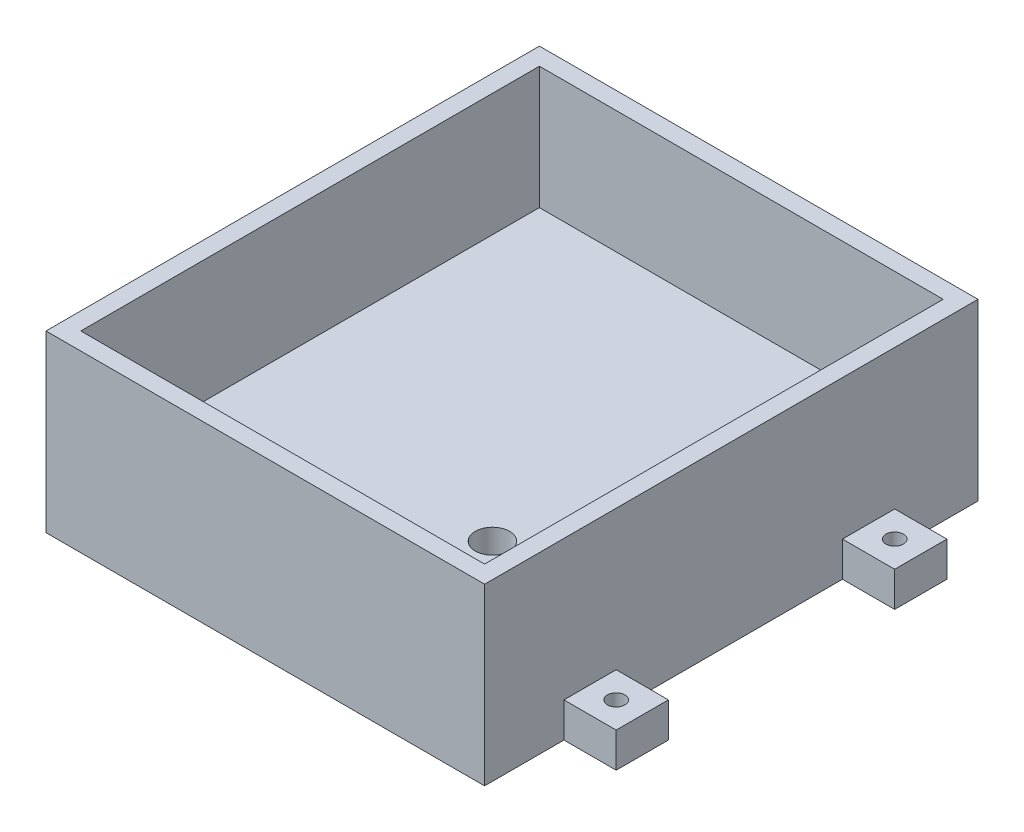
ISO-10303-21;
HEADER;
FILE_DESCRIPTION(('STEP AP214'),'2;1');
FILE_NAME('part.step','',(''),(''),'','','');
FILE_SCHEMA(('AUTOMOTIVE_DESIGN { 1 0 10303 214 1 1 1 1 }'));
ENDSEC;
DATA;
#1=APPLICATION_CONTEXT('core data for automotive mechanical design processes');
#2=APPLICATION_PROTOCOL_DEFINITION('international standard','automotive_design',2000,#1);
#3=PRODUCT_CONTEXT('',#1,'mechanical');
#4=PRODUCT('Part','Part','',(#3));
#5=PRODUCT_RELATED_PRODUCT_CATEGORY('part','',(#4));
#6=PRODUCT_DEFINITION_FORMATION('','',#4);
#7=PRODUCT_DEFINITION_CONTEXT('part definition',#1,'design');
#8=PRODUCT_DEFINITION('design','',#6,#7);
#9=PRODUCT_DEFINITION_SHAPE('','',#8);
#10=(LENGTH_UNIT() NAMED_UNIT(*) SI_UNIT(.MILLI.,.METRE.));
#11=(NAMED_UNIT(*) PLANE_ANGLE_UNIT() SI_UNIT($,.RADIAN.));
#12=(NAMED_UNIT(*) SI_UNIT($,.STERADIAN.) SOLID_ANGLE_UNIT());
#13=UNCERTAINTY_MEASURE_WITH_UNIT(LENGTH_MEASURE(1.E-05),#10,'distance_accuracy_value','');
#14=(GEOMETRIC_REPRESENTATION_CONTEXT(3) GLOBAL_UNCERTAINTY_ASSIGNED_CONTEXT((#13)) GLOBAL_UNIT_ASSIGNED_CONTEXT((#10,
#11,#12)) REPRESENTATION_CONTEXT('',''));
#15=CARTESIAN_POINT('',(0.,0.,0.));
#16=DIRECTION('',(0.,0.,1.));
#17=DIRECTION('',(1.,0.,0.));
#18=AXIS2_PLACEMENT_3D('',#15,#16,#17);
#19=CARTESIAN_POINT('',(80.,19.05,90.));
#20=DIRECTION('',(-1.,0.,0.));
#21=DIRECTION('',(0.,0.,1.));
#22=AXIS2_PLACEMENT_3D('',#19,#20,#21);
#23=PLANE('',#22);
#24=DIRECTION('',(0.,0.,-1.));
#25=VECTOR('',#24,1.);
#26=CARTESIAN_POINT('',(80.,12.7,41.995));
#27=LINE('',#26,#25);
#28=CARTESIAN_POINT('',(80.,12.7,61.045));
#29=VERTEX_POINT('',#28);
#30=CARTESIAN_POINT('',(80.,12.7,41.995));
#31=VERTEX_POINT('',#30);
#32=EDGE_CURVE('E51',#29,#31,#27,.T.);
#33=ORIENTED_EDGE('',*,*,#32,.T.);
#34=DIRECTION('',(0.,-1.,0.));
#35=VECTOR('',#34,1.);
#36=CARTESIAN_POINT('',(80.,12.7,41.995));
#37=LINE('',#36,#35);
#38=CARTESIAN_POINT('',(80.,0.,41.995));
#39=VERTEX_POINT('',#38);
#40=EDGE_CURVE('E229',#31,#39,#37,.T.);
#41=ORIENTED_EDGE('',*,*,#40,.T.);
#42=DIRECTION('',(0.,0.,-1.));
#43=VECTOR('',#42,1.);
#44=CARTESIAN_POINT('',(80.,0.,90.));
#45=LINE('',#44,#43);
#46=CARTESIAN_POINT('',(80.,0.,-40.555));
#47=VERTEX_POINT('',#46);
#48=EDGE_CURVE('E410',#39,#47,#45,.T.);
#49=ORIENTED_EDGE('',*,*,#48,.T.);
#50=DIRECTION('',(0.,-1.,0.));
#51=VECTOR('',#50,1.);
#52=CARTESIAN_POINT('',(80.,12.7,-40.555));
#53=LINE('',#52,#51);
#54=CARTESIAN_POINT('',(80.,12.7,-40.555));
#55=VERTEX_POINT('',#54);
#56=EDGE_CURVE('E265',#55,#47,#53,.T.);
#57=ORIENTED_EDGE('',*,*,#56,.F.);
#58=DIRECTION('',(0.,0.,-1.));
#59=VECTOR('',#58,1.);
#60=CARTESIAN_POINT('',(80.,12.7,-59.605));
#61=LINE('',#60,#59);
#62=CARTESIAN_POINT('',(80.,12.7,-59.605));
#63=VERTEX_POINT('',#62);
#64=EDGE_CURVE('E245',#55,#63,#61,.T.);
#65=ORIENTED_EDGE('',*,*,#64,.T.);
#66=DIRECTION('',(0.,-1.,0.));
#67=VECTOR('',#66,1.);
#68=CARTESIAN_POINT('',(80.,12.7,-59.605));
#69=LINE('',#68,#67);
#70=CARTESIAN_POINT('',(80.,0.,-59.6049999999999));
#71=VERTEX_POINT('',#70);
#72=EDGE_CURVE('E262',#63,#71,#69,.T.);
#73=ORIENTED_EDGE('',*,*,#72,.T.);
#74=CARTESIAN_POINT('',(80.,0.,-90.));
#75=VERTEX_POINT('',#74);
#76=EDGE_CURVE('E406',#71,#75,#45,.T.);
#77=ORIENTED_EDGE('',*,*,#76,.T.);
#78=DIRECTION('',(0.,-1.,0.));
#79=VECTOR('',#78,1.);
#80=CARTESIAN_POINT('',(80.,19.05,-90.));
#81=LINE('',#80,#79);
#82=CARTESIAN_POINT('',(80.,63.730000048,-90.));
#83=VERTEX_POINT('',#82);
#84=EDGE_CURVE('E11',#83,#75,#81,.T.);
#85=ORIENTED_EDGE('',*,*,#84,.F.);
#86=DIRECTION('',(0.,0.,-1.));
#87=VECTOR('',#86,1.);
#88=CARTESIAN_POINT('',(80.,63.730000048,-90.));
#89=LINE('',#88,#87);
#90=CARTESIAN_POINT('',(80.,63.730000048,90.));
#91=VERTEX_POINT('',#90);
#92=EDGE_CURVE('E400',#91,#83,#89,.T.);
#93=ORIENTED_EDGE('',*,*,#92,.F.);
#94=DIRECTION('',(0.,-1.,0.));
#95=VECTOR('',#94,1.);
#96=CARTESIAN_POINT('',(80.,19.05,90.));
#97=LINE('',#96,#95);
#98=CARTESIAN_POINT('',(80.,0.,90.));
#99=VERTEX_POINT('',#98);
#100=EDGE_CURVE('E419',#91,#99,#97,.T.);
#101=ORIENTED_EDGE('',*,*,#100,.T.);
#102=CARTESIAN_POINT('',(80.,0.,61.045));
#103=VERTEX_POINT('',#102);
#104=EDGE_CURVE('E407',#99,#103,#45,.T.);
#105=ORIENTED_EDGE('',*,*,#104,.T.);
#106=DIRECTION('',(0.,-1.,0.));
#107=VECTOR('',#106,1.);
#108=CARTESIAN_POINT('',(80.,12.7,61.045));
#109=LINE('',#108,#107);
#110=EDGE_CURVE('E47',#29,#103,#109,.T.);
#111=ORIENTED_EDGE('',*,*,#110,.F.);
#112=EDGE_LOOP('',(#33,#41,#49,#57,#65,#73,#77,#85,#93,#101,#105,#111));
#113=FACE_BOUND('',#112,.T.);
#114=ADVANCED_FACE('F33',(#113),#23,.F.);
#115=CARTESIAN_POINT('',(-80.,19.05,90.));
#116=DIRECTION('',(1.,0.,0.));
#117=DIRECTION('',(0.,0.,-1.));
#118=AXIS2_PLACEMENT_3D('',#115,#116,#117);
#119=PLANE('',#118);
#120=DIRECTION('',(0.,0.,1.));
#121=VECTOR('',#120,1.);
#122=CARTESIAN_POINT('',(-80.,0.,90.));
#123=LINE('',#122,#121);
#124=CARTESIAN_POINT('',(-80.,0.,-40.5549999999999));
#125=VERTEX_POINT('',#124);
#126=CARTESIAN_POINT('',(-80.,0.,41.995));
#127=VERTEX_POINT('',#126);
#128=EDGE_CURVE('E417',#125,#127,#123,.T.);
#129=ORIENTED_EDGE('',*,*,#128,.T.);
#130=DIRECTION('',(0.,-1.,0.));
#131=VECTOR('',#130,1.);
#132=CARTESIAN_POINT('',(-80.,12.7,41.995));
#133=LINE('',#132,#131);
#134=CARTESIAN_POINT('',(-80.,12.7,41.995));
#135=VERTEX_POINT('',#134);
#136=EDGE_CURVE('E295',#135,#127,#133,.T.);
#137=ORIENTED_EDGE('',*,*,#136,.F.);
#138=DIRECTION('',(0.,0.,1.));
#139=VECTOR('',#138,1.);
#140=CARTESIAN_POINT('',(-80.,12.7,41.995));
#141=LINE('',#140,#139);
#142=CARTESIAN_POINT('',(-80.,12.7,61.045));
#143=VERTEX_POINT('',#142);
#144=EDGE_CURVE('E275',#135,#143,#141,.T.);
#145=ORIENTED_EDGE('',*,*,#144,.T.);
#146=DIRECTION('',(0.,-1.,0.));
#147=VECTOR('',#146,1.);
#148=CARTESIAN_POINT('',(-80.,12.7,61.045));
#149=LINE('',#148,#147);
#150=CARTESIAN_POINT('',(-80.,0.,61.045));
#151=VERTEX_POINT('',#150);
#152=EDGE_CURVE('E287',#143,#151,#149,.T.);
#153=ORIENTED_EDGE('',*,*,#152,.T.);
#154=CARTESIAN_POINT('',(-80.,0.,90.));
#155=VERTEX_POINT('',#154);
#156=EDGE_CURVE('E412',#151,#155,#123,.T.);
#157=ORIENTED_EDGE('',*,*,#156,.T.);
#158=DIRECTION('',(0.,-1.,0.));
#159=VECTOR('',#158,1.);
#160=CARTESIAN_POINT('',(-80.,19.05,90.));
#161=LINE('',#160,#159);
#162=CARTESIAN_POINT('',(-80.,63.730000048,90.));
#163=VERTEX_POINT('',#162);
#164=EDGE_CURVE('E422',#163,#155,#161,.T.);
#165=ORIENTED_EDGE('',*,*,#164,.F.);
#166=DIRECTION('',(0.,0.,1.));
#167=VECTOR('',#166,1.);
#168=CARTESIAN_POINT('',(-80.,63.730000048,-90.));
#169=LINE('',#168,#167);
#170=CARTESIAN_POINT('',(-80.,63.730000048,-90.));
#171=VERTEX_POINT('',#170);
#172=EDGE_CURVE('E394',#171,#163,#169,.T.);
#173=ORIENTED_EDGE('',*,*,#172,.F.);
#174=DIRECTION('',(0.,-1.,0.));
#175=VECTOR('',#174,1.);
#176=CARTESIAN_POINT('',(-80.,19.05,-90.));
#177=LINE('',#176,#175);
#178=CARTESIAN_POINT('',(-80.,0.,-90.));
#179=VERTEX_POINT('',#178);
#180=EDGE_CURVE('E40',#171,#179,#177,.T.);
#181=ORIENTED_EDGE('',*,*,#180,.T.);
#182=CARTESIAN_POINT('',(-80.,0.,-59.605));
#183=VERTEX_POINT('',#182);
#184=EDGE_CURVE('E413',#179,#183,#123,.T.);
#185=ORIENTED_EDGE('',*,*,#184,.T.);
#186=DIRECTION('',(0.,-1.,0.));
#187=VECTOR('',#186,1.);
#188=CARTESIAN_POINT('',(-80.,12.7,-59.605));
#189=LINE('',#188,#187);
#190=CARTESIAN_POINT('',(-80.,12.7,-59.605));
#191=VERTEX_POINT('',#190);
#192=EDGE_CURVE('E332',#191,#183,#189,.T.);
#193=ORIENTED_EDGE('',*,*,#192,.F.);
#194=DIRECTION('',(0.,0.,1.));
#195=VECTOR('',#194,1.);
#196=CARTESIAN_POINT('',(-80.,12.7,-59.605));
#197=LINE('',#196,#195);
#198=CARTESIAN_POINT('',(-80.,12.7,-40.555));
#199=VERTEX_POINT('',#198);
#200=EDGE_CURVE('E311',#191,#199,#197,.T.);
#201=ORIENTED_EDGE('',*,*,#200,.T.);
#202=DIRECTION('',(0.,-1.,0.));
#203=VECTOR('',#202,1.);
#204=CARTESIAN_POINT('',(-80.,12.7,-40.555));
#205=LINE('',#204,#203);
#206=EDGE_CURVE('E324',#199,#125,#205,.T.);
#207=ORIENTED_EDGE('',*,*,#206,.T.);
#208=EDGE_LOOP('',(#129,#137,#145,#153,#157,#165,#173,#181,#185,#193,#201,#207));
#209=FACE_BOUND('',#208,.T.);
#210=ADVANCED_FACE('F428',(#209),#119,.F.);
#211=CARTESIAN_POINT('',(-80.,19.05,-90.));
#212=DIRECTION('',(0.,0.,1.));
#213=DIRECTION('',(1.,0.,0.));
#214=AXIS2_PLACEMENT_3D('',#211,#212,#213);
#215=PLANE('',#214);
#216=DIRECTION('',(-1.,0.,0.));
#217=VECTOR('',#216,1.);
#218=CARTESIAN_POINT('',(-80.,0.,-90.));
#219=LINE('',#218,#217);
#220=EDGE_CURVE('E409',#75,#179,#219,.T.);
#221=ORIENTED_EDGE('',*,*,#220,.T.);
#222=ORIENTED_EDGE('',*,*,#180,.F.);
#223=DIRECTION('',(-1.,0.,0.));
#224=VECTOR('',#223,1.);
#225=CARTESIAN_POINT('',(-80.,63.730000048,-90.));
#226=LINE('',#225,#224);
#227=EDGE_CURVE('E403',#83,#171,#226,.T.);
#228=ORIENTED_EDGE('',*,*,#227,.F.);
#229=ORIENTED_EDGE('',*,*,#84,.T.);
#230=EDGE_LOOP('',(#221,#222,#228,#229));
#231=FACE_BOUND('',#230,.T.);
#232=ADVANCED_FACE('F461',(#231),#215,.F.);
#233=CARTESIAN_POINT('',(-80.,19.05,90.));
#234=DIRECTION('',(0.,0.,-1.));
#235=DIRECTION('',(-1.,0.,0.));
#236=AXIS2_PLACEMENT_3D('',#233,#234,#235);
#237=PLANE('',#236);
#238=DIRECTION('',(1.,0.,0.));
#239=VECTOR('',#238,1.);
#240=CARTESIAN_POINT('',(-80.,0.,90.));
#241=LINE('',#240,#239);
#242=EDGE_CURVE('E416',#155,#99,#241,.T.);
#243=ORIENTED_EDGE('',*,*,#242,.T.);
#244=ORIENTED_EDGE('',*,*,#100,.F.);
#245=DIRECTION('',(1.,0.,0.));
#246=VECTOR('',#245,1.);
#247=CARTESIAN_POINT('',(-80.,63.730000048,90.));
#248=LINE('',#247,#246);
#249=EDGE_CURVE('E397',#163,#91,#248,.T.);
#250=ORIENTED_EDGE('',*,*,#249,.F.);
#251=ORIENTED_EDGE('',*,*,#164,.T.);
#252=EDGE_LOOP('',(#243,#244,#250,#251));
#253=FACE_BOUND('',#252,.T.);
#254=ADVANCED_FACE('F456',(#253),#237,.F.);
#255=CARTESIAN_POINT('',(0.,0.,0.));
#256=DIRECTION('',(0.,-1.,0.));
#257=DIRECTION('',(0.,0.,-1.));
#258=AXIS2_PLACEMENT_3D('',#255,#256,#257);
#259=PLANE('',#258);
#260=ORIENTED_EDGE('',*,*,#104,.F.);
#261=ORIENTED_EDGE('',*,*,#242,.F.);
#262=ORIENTED_EDGE('',*,*,#156,.F.);
#263=DIRECTION('',(-1.,0.,0.));
#264=VECTOR('',#263,1.);
#265=CARTESIAN_POINT('',(-80.,0.,61.045));
#266=LINE('',#265,#264);
#267=CARTESIAN_POINT('',(-99.05,0.,61.045));
#268=VERTEX_POINT('',#267);
#269=EDGE_CURVE('E272',#151,#268,#266,.T.);
#270=ORIENTED_EDGE('',*,*,#269,.T.);
#271=DIRECTION('',(0.,0.,-1.));
#272=VECTOR('',#271,1.);
#273=CARTESIAN_POINT('',(-99.05,0.,41.995));
#274=LINE('',#273,#272);
#275=CARTESIAN_POINT('',(-99.05,0.,41.995));
#276=VERTEX_POINT('',#275);
#277=EDGE_CURVE('E290',#268,#276,#274,.T.);
#278=ORIENTED_EDGE('',*,*,#277,.T.);
#279=DIRECTION('',(1.,0.,0.));
#280=VECTOR('',#279,1.);
#281=CARTESIAN_POINT('',(-80.,0.,41.995));
#282=LINE('',#281,#280);
#283=EDGE_CURVE('E278',#276,#127,#282,.T.);
#284=ORIENTED_EDGE('',*,*,#283,.T.);
#285=ORIENTED_EDGE('',*,*,#128,.F.);
#286=DIRECTION('',(-1.,0.,0.));
#287=VECTOR('',#286,1.);
#288=CARTESIAN_POINT('',(-80.,0.,-40.555));
#289=LINE('',#288,#287);
#290=CARTESIAN_POINT('',(-99.05,0.,-40.555));
#291=VERTEX_POINT('',#290);
#292=EDGE_CURVE('E308',#125,#291,#289,.T.);
#293=ORIENTED_EDGE('',*,*,#292,.T.);
#294=DIRECTION('',(0.,0.,-1.));
#295=VECTOR('',#294,1.);
#296=CARTESIAN_POINT('',(-99.05,0.,-59.605));
#297=LINE('',#296,#295);
#298=CARTESIAN_POINT('',(-99.05,0.,-59.605));
#299=VERTEX_POINT('',#298);
#300=EDGE_CURVE('E327',#291,#299,#297,.T.);
#301=ORIENTED_EDGE('',*,*,#300,.T.);
#302=DIRECTION('',(1.,0.,0.));
#303=VECTOR('',#302,1.);
#304=CARTESIAN_POINT('',(-80.,0.,-59.605));
#305=LINE('',#304,#303);
#306=EDGE_CURVE('E315',#299,#183,#305,.T.);
#307=ORIENTED_EDGE('',*,*,#306,.T.);
#308=ORIENTED_EDGE('',*,*,#184,.F.);
#309=ORIENTED_EDGE('',*,*,#220,.F.);
#310=ORIENTED_EDGE('',*,*,#76,.F.);
#311=DIRECTION('',(1.,0.,0.));
#312=VECTOR('',#311,1.);
#313=CARTESIAN_POINT('',(99.05,0.,-59.605));
#314=LINE('',#313,#312);
#315=CARTESIAN_POINT('',(99.05,0.,-59.605));
#316=VERTEX_POINT('',#315);
#317=EDGE_CURVE('E242',#71,#316,#314,.T.);
#318=ORIENTED_EDGE('',*,*,#317,.T.);
#319=DIRECTION('',(0.,0.,1.));
#320=VECTOR('',#319,1.);
#321=CARTESIAN_POINT('',(99.05,0.,-59.605));
#322=LINE('',#321,#320);
#323=CARTESIAN_POINT('',(99.05,0.,-40.555));
#324=VERTEX_POINT('',#323);
#325=EDGE_CURVE('E235',#316,#324,#322,.T.);
#326=ORIENTED_EDGE('',*,*,#325,.T.);
#327=DIRECTION('',(-1.,0.,0.));
#328=VECTOR('',#327,1.);
#329=CARTESIAN_POINT('',(99.05,0.,-40.555));
#330=LINE('',#329,#328);
#331=EDGE_CURVE('E254',#324,#47,#330,.T.);
#332=ORIENTED_EDGE('',*,*,#331,.T.);
#333=ORIENTED_EDGE('',*,*,#48,.F.);
#334=DIRECTION('',(1.,0.,0.));
#335=VECTOR('',#334,1.);
#336=CARTESIAN_POINT('',(99.05,0.,41.995));
#337=LINE('',#336,#335);
#338=CARTESIAN_POINT('',(99.05,0.,41.995));
#339=VERTEX_POINT('',#338);
#340=EDGE_CURVE('E213',#39,#339,#337,.T.);
#341=ORIENTED_EDGE('',*,*,#340,.T.);
#342=DIRECTION('',(0.,0.,1.));
#343=VECTOR('',#342,1.);
#344=CARTESIAN_POINT('',(99.05,0.,41.995));
#345=LINE('',#344,#343);
#346=CARTESIAN_POINT('',(99.05,0.,61.045));
#347=VERTEX_POINT('',#346);
#348=EDGE_CURVE('E223',#339,#347,#345,.T.);
#349=ORIENTED_EDGE('',*,*,#348,.T.);
#350=DIRECTION('',(-1.,0.,0.));
#351=VECTOR('',#350,1.);
#352=CARTESIAN_POINT('',(99.05,0.,61.045));
#353=LINE('',#352,#351);
#354=EDGE_CURVE('E197',#347,#103,#353,.T.);
#355=ORIENTED_EDGE('',*,*,#354,.T.);
#356=EDGE_LOOP('',(#260,#261,#262,#270,#278,#284,#285,#293,#301,#307,#308,#309,#310,#318,#326,
#332,#333,#341,#349,#355));
#357=FACE_BOUND('',#356,.T.);
#358=CARTESIAN_POINT('',(-89.525,0.,-50.08));
#359=DIRECTION('',(0.,-1.,0.));
#360=DIRECTION('',(0.,0.,-1.));
#361=AXIS2_PLACEMENT_3D('',#358,#359,#360);
#362=CIRCLE('',#361,3.175);
#363=CARTESIAN_POINT('',(-89.525,0.,-53.255));
#364=VERTEX_POINT('',#363);
#365=EDGE_CURVE('E298',#364,#364,#362,.T.);
#366=ORIENTED_EDGE('',*,*,#365,.F.);
#367=EDGE_LOOP('',(#366));
#368=FACE_BOUND('',#367,.T.);
#369=CARTESIAN_POINT('',(-89.525,0.,51.52));
#370=DIRECTION('',(0.,-1.,0.));
#371=DIRECTION('',(0.,0.,-1.));
#372=AXIS2_PLACEMENT_3D('',#369,#370,#371);
#373=CIRCLE('',#372,3.175);
#374=CARTESIAN_POINT('',(-89.525,0.,48.345));
#375=VERTEX_POINT('',#374);
#376=EDGE_CURVE('E261',#375,#375,#373,.T.);
#377=ORIENTED_EDGE('',*,*,#376,.F.);
#378=EDGE_LOOP('',(#377));
#379=FACE_BOUND('',#378,.T.);
#380=CARTESIAN_POINT('',(89.525,0.,-50.08));
#381=DIRECTION('',(0.,-1.,0.));
#382=DIRECTION('',(0.,0.,-1.));
#383=AXIS2_PLACEMENT_3D('',#380,#381,#382);
#384=CIRCLE('',#383,3.175);
#385=CARTESIAN_POINT('',(89.525,0.,-53.255));
#386=VERTEX_POINT('',#385);
#387=EDGE_CURVE('E228',#386,#386,#384,.T.);
#388=ORIENTED_EDGE('',*,*,#387,.F.);
#389=EDGE_LOOP('',(#388));
#390=FACE_BOUND('',#389,.T.);
#391=CARTESIAN_POINT('',(89.525,0.,51.52));
#392=DIRECTION('',(0.,-1.,0.));
#393=DIRECTION('',(0.,0.,-1.));
#394=AXIS2_PLACEMENT_3D('',#391,#392,#393);
#395=CIRCLE('',#394,3.175);
#396=CARTESIAN_POINT('',(89.525,0.,48.345));
#397=VERTEX_POINT('',#396);
#398=EDGE_CURVE('E218',#397,#397,#395,.T.);
#399=ORIENTED_EDGE('',*,*,#398,.F.);
#400=EDGE_LOOP('',(#399));
#401=FACE_BOUND('',#400,.T.);
#402=ADVANCED_FACE('F435',(#357,#368,#379,#390,#401),#259,.T.);
#403=CARTESIAN_POINT('',(0.,63.730000048,0.));
#404=DIRECTION('',(0.,1.,0.));
#405=DIRECTION('',(0.,0.,1.));
#406=AXIS2_PLACEMENT_3D('',#403,#404,#405);
#407=PLANE('',#406);
#408=ORIENTED_EDGE('',*,*,#172,.T.);
#409=ORIENTED_EDGE('',*,*,#249,.T.);
#410=ORIENTED_EDGE('',*,*,#92,.T.);
#411=ORIENTED_EDGE('',*,*,#227,.T.);
#412=EDGE_LOOP('',(#408,#409,#410,#411));
#413=FACE_BOUND('',#412,.T.);
#414=DIRECTION('',(1.,0.,0.));
#415=VECTOR('',#414,1.);
#416=CARTESIAN_POINT('',(-73.65,63.730000048,83.65));
#417=LINE('',#416,#415);
#418=CARTESIAN_POINT('',(-73.65,63.730000048,83.65));
#419=VERTEX_POINT('',#418);
#420=CARTESIAN_POINT('',(73.65,63.730000048,83.65));
#421=VERTEX_POINT('',#420);
#422=EDGE_CURVE('E367',#419,#421,#417,.T.);
#423=ORIENTED_EDGE('',*,*,#422,.F.);
#424=DIRECTION('',(0.,0.,1.));
#425=VECTOR('',#424,1.);
#426=CARTESIAN_POINT('',(-73.65,63.730000048,-83.65));
#427=LINE('',#426,#425);
#428=CARTESIAN_POINT('',(-73.65,63.730000048,-83.65));
#429=VERTEX_POINT('',#428);
#430=EDGE_CURVE('E365',#429,#419,#427,.T.);
#431=ORIENTED_EDGE('',*,*,#430,.F.);
#432=DIRECTION('',(-1.,0.,0.));
#433=VECTOR('',#432,1.);
#434=CARTESIAN_POINT('',(-73.65,63.730000048,-83.65));
#435=LINE('',#434,#433);
#436=CARTESIAN_POINT('',(73.65,63.730000048,-83.65));
#437=VERTEX_POINT('',#436);
#438=EDGE_CURVE('E373',#437,#429,#435,.T.);
#439=ORIENTED_EDGE('',*,*,#438,.F.);
#440=DIRECTION('',(0.,0.,-1.));
#441=VECTOR('',#440,1.);
#442=CARTESIAN_POINT('',(73.65,63.730000048,-83.65));
#443=LINE('',#442,#441);
#444=EDGE_CURVE('E370',#421,#437,#443,.T.);
#445=ORIENTED_EDGE('',*,*,#444,.F.);
#446=EDGE_LOOP('',(#423,#431,#439,#445));
#447=FACE_BOUND('',#446,.T.);
#448=ADVANCED_FACE('F459',(#413,#447),#407,.T.);
#449=CARTESIAN_POINT('',(-73.65,63.730000048,-83.65));
#450=DIRECTION('',(1.,0.,0.));
#451=DIRECTION('',(0.,0.,-1.));
#452=AXIS2_PLACEMENT_3D('',#449,#450,#451);
#453=PLANE('',#452);
#454=DIRECTION('',(0.,0.,1.));
#455=VECTOR('',#454,1.);
#456=CARTESIAN_POINT('',(-73.65,19.05,-83.65));
#457=LINE('',#456,#455);
#458=CARTESIAN_POINT('',(-73.65,19.05,-83.65));
#459=VERTEX_POINT('',#458);
#460=CARTESIAN_POINT('',(-73.65,19.05,83.65));
#461=VERTEX_POINT('',#460);
#462=EDGE_CURVE('E362',#459,#461,#457,.T.);
#463=ORIENTED_EDGE('',*,*,#462,.F.);
#464=DIRECTION('',(0.,-1.,0.));
#465=VECTOR('',#464,1.);
#466=CARTESIAN_POINT('',(-73.65,63.730000048,-83.65));
#467=LINE('',#466,#465);
#468=EDGE_CURVE('E375',#429,#459,#467,.T.);
#469=ORIENTED_EDGE('',*,*,#468,.F.);
#470=ORIENTED_EDGE('',*,*,#430,.T.);
#471=DIRECTION('',(0.,-1.,0.));
#472=VECTOR('',#471,1.);
#473=CARTESIAN_POINT('',(-73.65,63.730000048,83.65));
#474=LINE('',#473,#472);
#475=EDGE_CURVE('E391',#419,#461,#474,.T.);
#476=ORIENTED_EDGE('',*,*,#475,.T.);
#477=EDGE_LOOP('',(#463,#469,#470,#476));
#478=FACE_BOUND('',#477,.T.);
#479=ADVANCED_FACE('F508',(#478),#453,.T.);
#480=CARTESIAN_POINT('',(-73.65,63.730000048,83.65));
#481=DIRECTION('',(0.,0.,-1.));
#482=DIRECTION('',(-1.,0.,0.));
#483=AXIS2_PLACEMENT_3D('',#480,#481,#482);
#484=PLANE('',#483);
#485=DIRECTION('',(1.,0.,0.));
#486=VECTOR('',#485,1.);
#487=CARTESIAN_POINT('',(-73.65,19.05,83.65));
#488=LINE('',#487,#486);
#489=CARTESIAN_POINT('',(73.65,19.05,83.65));
#490=VERTEX_POINT('',#489);
#491=EDGE_CURVE('E378',#461,#490,#488,.T.);
#492=ORIENTED_EDGE('',*,*,#491,.F.);
#493=ORIENTED_EDGE('',*,*,#475,.F.);
#494=ORIENTED_EDGE('',*,*,#422,.T.);
#495=DIRECTION('',(0.,-1.,0.));
#496=VECTOR('',#495,1.);
#497=CARTESIAN_POINT('',(73.65,63.730000048,83.65));
#498=LINE('',#497,#496);
#499=EDGE_CURVE('E389',#421,#490,#498,.T.);
#500=ORIENTED_EDGE('',*,*,#499,.T.);
#501=EDGE_LOOP('',(#492,#493,#494,#500));
#502=FACE_BOUND('',#501,.T.);
#503=ADVANCED_FACE('F511',(#502),#484,.T.);
#504=CARTESIAN_POINT('',(73.65,63.730000048,-83.65));
#505=DIRECTION('',(-1.,0.,0.));
#506=DIRECTION('',(0.,0.,1.));
#507=AXIS2_PLACEMENT_3D('',#504,#505,#506);
#508=PLANE('',#507);
#509=DIRECTION('',(0.,0.,-1.));
#510=VECTOR('',#509,1.);
#511=CARTESIAN_POINT('',(73.65,19.05,-83.65));
#512=LINE('',#511,#510);
#513=CARTESIAN_POINT('',(73.65,19.05,-83.65));
#514=VERTEX_POINT('',#513);
#515=EDGE_CURVE('E381',#490,#514,#512,.T.);
#516=ORIENTED_EDGE('',*,*,#515,.F.);
#517=ORIENTED_EDGE('',*,*,#499,.F.);
#518=ORIENTED_EDGE('',*,*,#444,.T.);
#519=DIRECTION('',(0.,-1.,0.));
#520=VECTOR('',#519,1.);
#521=CARTESIAN_POINT('',(73.65,63.730000048,-83.65));
#522=LINE('',#521,#520);
#523=EDGE_CURVE('E387',#437,#514,#522,.T.);
#524=ORIENTED_EDGE('',*,*,#523,.T.);
#525=EDGE_LOOP('',(#516,#517,#518,#524));
#526=FACE_BOUND('',#525,.T.);
#527=ADVANCED_FACE('F515',(#526),#508,.T.);
#528=CARTESIAN_POINT('',(-73.65,63.730000048,-83.65));
#529=DIRECTION('',(0.,0.,1.));
#530=DIRECTION('',(1.,0.,0.));
#531=AXIS2_PLACEMENT_3D('',#528,#529,#530);
#532=PLANE('',#531);
#533=DIRECTION('',(-1.,0.,0.));
#534=VECTOR('',#533,1.);
#535=CARTESIAN_POINT('',(-73.65,19.05,-83.65));
#536=LINE('',#535,#534);
#537=EDGE_CURVE('E368',#514,#459,#536,.T.);
#538=ORIENTED_EDGE('',*,*,#537,.F.);
#539=ORIENTED_EDGE('',*,*,#523,.F.);
#540=ORIENTED_EDGE('',*,*,#438,.T.);
#541=ORIENTED_EDGE('',*,*,#468,.T.);
#542=EDGE_LOOP('',(#538,#539,#540,#541));
#543=FACE_BOUND('',#542,.T.);
#544=ADVANCED_FACE('F504',(#543),#532,.T.);
#545=CARTESIAN_POINT('',(0.,19.05,0.));
#546=DIRECTION('',(0.,-1.,0.));
#547=DIRECTION('',(0.,0.,-1.));
#548=AXIS2_PLACEMENT_3D('',#545,#546,#547);
#549=PLANE('',#548);
#550=CARTESIAN_POINT('',(23.17,19.05,45.5500000000002));
#551=DIRECTION('',(0.,1.,0.));
#552=DIRECTION('',(0.,0.,1.));
#553=AXIS2_PLACEMENT_3D('',#550,#551,#552);
#554=CIRCLE('',#553,6.253999938);
#555=CARTESIAN_POINT('',(23.17,19.05,51.8039999380002));
#556=VERTEX_POINT('',#555);
#557=EDGE_CURVE('E345',#556,#556,#554,.T.);
#558=ORIENTED_EDGE('',*,*,#557,.F.);
#559=EDGE_LOOP('',(#558));
#560=FACE_BOUND('',#559,.T.);
#561=CARTESIAN_POINT('',(38.41,19.05,30.3100000000001));
#562=DIRECTION('',(0.,1.,0.));
#563=DIRECTION('',(0.,0.,1.));
#564=AXIS2_PLACEMENT_3D('',#561,#562,#563);
#565=CIRCLE('',#564,6.253999938);
#566=CARTESIAN_POINT('',(38.41,19.05,36.5639999380001));
#567=VERTEX_POINT('',#566);
#568=EDGE_CURVE('E351',#567,#567,#565,.T.);
#569=ORIENTED_EDGE('',*,*,#568,.F.);
#570=EDGE_LOOP('',(#569));
#571=FACE_BOUND('',#570,.T.);
#572=CARTESIAN_POINT('',(23.17,19.05,30.3100000000002));
#573=DIRECTION('',(0.,1.,0.));
#574=DIRECTION('',(0.,0.,1.));
#575=AXIS2_PLACEMENT_3D('',#572,#573,#574);
#576=CIRCLE('',#575,6.253999938);
#577=CARTESIAN_POINT('',(23.17,19.05,36.5639999380002));
#578=VERTEX_POINT('',#577);
#579=EDGE_CURVE('E334',#578,#578,#576,.T.);
#580=ORIENTED_EDGE('',*,*,#579,.F.);
#581=EDGE_LOOP('',(#580));
#582=FACE_BOUND('',#581,.T.);
#583=CARTESIAN_POINT('',(38.41,19.05,45.5500000000001));
#584=DIRECTION('',(0.,1.,0.));
#585=DIRECTION('',(0.,0.,1.));
#586=AXIS2_PLACEMENT_3D('',#583,#584,#585);
#587=CIRCLE('',#586,6.253999938);
#588=CARTESIAN_POINT('',(38.41,19.05,51.8039999380001));
#589=VERTEX_POINT('',#588);
#590=EDGE_CURVE('E344',#589,#589,#587,.T.);
#591=ORIENTED_EDGE('',*,*,#590,.F.);
#592=EDGE_LOOP('',(#591));
#593=FACE_BOUND('',#592,.T.);
#594=ORIENTED_EDGE('',*,*,#537,.T.);
#595=ORIENTED_EDGE('',*,*,#462,.T.);
#596=ORIENTED_EDGE('',*,*,#491,.T.);
#597=ORIENTED_EDGE('',*,*,#515,.T.);
#598=EDGE_LOOP('',(#594,#595,#596,#597));
#599=FACE_BOUND('',#598,.T.);
#600=ADVANCED_FACE('F500',(#560,#571,#582,#593,#599),#549,.F.);
#601=CARTESIAN_POINT('',(38.41,6.35,45.5500000000001));
#602=DIRECTION('',(0.,1.,0.));
#603=DIRECTION('',(0.,0.,1.));
#604=AXIS2_PLACEMENT_3D('',#601,#602,#603);
#605=CYLINDRICAL_SURFACE('',#604,6.253999938);
#606=CARTESIAN_POINT('',(38.41,6.35,45.5500000000001));
#607=DIRECTION('',(0.,1.,0.));
#608=DIRECTION('',(0.,0.,1.));
#609=AXIS2_PLACEMENT_3D('',#606,#607,#608);
#610=CIRCLE('',#609,6.253999938);
#611=CARTESIAN_POINT('',(38.41,6.35,51.8039999380001));
#612=VERTEX_POINT('',#611);
#613=EDGE_CURVE('E359',#612,#612,#610,.T.);
#614=ORIENTED_EDGE('',*,*,#613,.F.);
#615=EDGE_LOOP('',(#614));
#616=FACE_BOUND('',#615,.T.);
#617=ORIENTED_EDGE('',*,*,#590,.T.);
#618=EDGE_LOOP('',(#617));
#619=FACE_BOUND('',#618,.T.);
#620=ADVANCED_FACE('F503',(#616,#619),#605,.F.);
#621=CARTESIAN_POINT('',(38.41,6.35,45.5500000000001));
#622=DIRECTION('',(0.,1.,0.));
#623=DIRECTION('',(0.,0.,1.));
#624=AXIS2_PLACEMENT_3D('',#621,#622,#623);
#625=PLANE('',#624);
#626=ORIENTED_EDGE('',*,*,#613,.T.);
#627=EDGE_LOOP('',(#626));
#628=FACE_BOUND('',#627,.T.);
#629=ADVANCED_FACE('F525',(#628),#625,.T.);
#630=CARTESIAN_POINT('',(23.17,6.35,30.3100000000002));
#631=DIRECTION('',(0.,1.,0.));
#632=DIRECTION('',(0.,0.,1.));
#633=AXIS2_PLACEMENT_3D('',#630,#631,#632);
#634=CYLINDRICAL_SURFACE('',#633,6.253999938);
#635=CARTESIAN_POINT('',(23.17,6.35,30.3100000000002));
#636=DIRECTION('',(0.,1.,0.));
#637=DIRECTION('',(0.,0.,1.));
#638=AXIS2_PLACEMENT_3D('',#635,#636,#637);
#639=CIRCLE('',#638,6.253999938);
#640=CARTESIAN_POINT('',(23.17,6.35,36.5639999380002));
#641=VERTEX_POINT('',#640);
#642=EDGE_CURVE('E354',#641,#641,#639,.T.);
#643=ORIENTED_EDGE('',*,*,#642,.F.);
#644=EDGE_LOOP('',(#643));
#645=FACE_BOUND('',#644,.T.);
#646=ORIENTED_EDGE('',*,*,#579,.T.);
#647=EDGE_LOOP('',(#646));
#648=FACE_BOUND('',#647,.T.);
#649=ADVANCED_FACE('F529',(#645,#648),#634,.F.);
#650=CARTESIAN_POINT('',(23.17,6.35,30.3100000000002));
#651=DIRECTION('',(0.,1.,0.));
#652=DIRECTION('',(0.,0.,1.));
#653=AXIS2_PLACEMENT_3D('',#650,#651,#652);
#654=PLANE('',#653);
#655=ORIENTED_EDGE('',*,*,#642,.T.);
#656=EDGE_LOOP('',(#655));
#657=FACE_BOUND('',#656,.T.);
#658=ADVANCED_FACE('F533',(#657),#654,.T.);
#659=CARTESIAN_POINT('',(38.41,6.35,30.3100000000001));
#660=DIRECTION('',(0.,1.,0.));
#661=DIRECTION('',(0.,0.,1.));
#662=AXIS2_PLACEMENT_3D('',#659,#660,#661);
#663=CYLINDRICAL_SURFACE('',#662,6.253999938);
#664=CARTESIAN_POINT('',(38.41,6.35,30.3100000000001));
#665=DIRECTION('',(0.,1.,0.));
#666=DIRECTION('',(0.,0.,1.));
#667=AXIS2_PLACEMENT_3D('',#664,#665,#666);
#668=CIRCLE('',#667,6.253999938);
#669=CARTESIAN_POINT('',(38.41,6.35,36.5639999380001));
#670=VERTEX_POINT('',#669);
#671=EDGE_CURVE('E348',#670,#670,#668,.T.);
#672=ORIENTED_EDGE('',*,*,#671,.F.);
#673=EDGE_LOOP('',(#672));
#674=FACE_BOUND('',#673,.T.);
#675=ORIENTED_EDGE('',*,*,#568,.T.);
#676=EDGE_LOOP('',(#675));
#677=FACE_BOUND('',#676,.T.);
#678=ADVANCED_FACE('F537',(#674,#677),#663,.F.);
#679=CARTESIAN_POINT('',(38.41,6.35,30.3100000000001));
#680=DIRECTION('',(0.,1.,0.));
#681=DIRECTION('',(0.,0.,1.));
#682=AXIS2_PLACEMENT_3D('',#679,#680,#681);
#683=PLANE('',#682);
#684=ORIENTED_EDGE('',*,*,#671,.T.);
#685=EDGE_LOOP('',(#684));
#686=FACE_BOUND('',#685,.T.);
#687=ADVANCED_FACE('F541',(#686),#683,.T.);
#688=CARTESIAN_POINT('',(23.17,6.35,45.5500000000002));
#689=DIRECTION('',(0.,1.,0.));
#690=DIRECTION('',(0.,0.,1.));
#691=AXIS2_PLACEMENT_3D('',#688,#689,#690);
#692=CYLINDRICAL_SURFACE('',#691,6.253999938);
#693=CARTESIAN_POINT('',(23.17,6.35,45.5500000000002));
#694=DIRECTION('',(0.,1.,0.));
#695=DIRECTION('',(0.,0.,1.));
#696=AXIS2_PLACEMENT_3D('',#693,#694,#695);
#697=CIRCLE('',#696,6.253999938);
#698=CARTESIAN_POINT('',(23.17,6.35,51.8039999380002));
#699=VERTEX_POINT('',#698);
#700=EDGE_CURVE('E341',#699,#699,#697,.T.);
#701=ORIENTED_EDGE('',*,*,#700,.F.);
#702=EDGE_LOOP('',(#701));
#703=FACE_BOUND('',#702,.T.);
#704=ORIENTED_EDGE('',*,*,#557,.T.);
#705=EDGE_LOOP('',(#704));
#706=FACE_BOUND('',#705,.T.);
#707=ADVANCED_FACE('F545',(#703,#706),#692,.F.);
#708=CARTESIAN_POINT('',(23.17,6.35,45.5500000000002));
#709=DIRECTION('',(0.,1.,0.));
#710=DIRECTION('',(0.,0.,1.));
#711=AXIS2_PLACEMENT_3D('',#708,#709,#710);
#712=PLANE('',#711);
#713=ORIENTED_EDGE('',*,*,#700,.T.);
#714=EDGE_LOOP('',(#713));
#715=FACE_BOUND('',#714,.T.);
#716=ADVANCED_FACE('F549',(#715),#712,.T.);
#717=CARTESIAN_POINT('',(-80.,12.7,-59.605));
#718=DIRECTION('',(0.,0.,-1.));
#719=DIRECTION('',(-1.,0.,0.));
#720=AXIS2_PLACEMENT_3D('',#717,#718,#719);
#721=PLANE('',#720);
#722=ORIENTED_EDGE('',*,*,#306,.F.);
#723=DIRECTION('',(0.,-1.,0.));
#724=VECTOR('',#723,1.);
#725=CARTESIAN_POINT('',(-99.05,12.7,-59.605));
#726=LINE('',#725,#724);
#727=CARTESIAN_POINT('',(-99.05,12.7,-59.605));
#728=VERTEX_POINT('',#727);
#729=EDGE_CURVE('E335',#728,#299,#726,.T.);
#730=ORIENTED_EDGE('',*,*,#729,.F.);
#731=DIRECTION('',(1.,0.,0.));
#732=VECTOR('',#731,1.);
#733=CARTESIAN_POINT('',(-80.,12.7,-59.605));
#734=LINE('',#733,#732);
#735=EDGE_CURVE('E321',#728,#191,#734,.T.);
#736=ORIENTED_EDGE('',*,*,#735,.T.);
#737=ORIENTED_EDGE('',*,*,#192,.T.);
#738=EDGE_LOOP('',(#722,#730,#736,#737));
#739=FACE_BOUND('',#738,.T.);
#740=ADVANCED_FACE('F441',(#739),#721,.T.);
#741=CARTESIAN_POINT('',(-99.05,12.7,-59.605));
#742=DIRECTION('',(-1.,0.,0.));
#743=DIRECTION('',(0.,0.,1.));
#744=AXIS2_PLACEMENT_3D('',#741,#742,#743);
#745=PLANE('',#744);
#746=ORIENTED_EDGE('',*,*,#300,.F.);
#747=DIRECTION('',(0.,-1.,0.));
#748=VECTOR('',#747,1.);
#749=CARTESIAN_POINT('',(-99.05,12.7,-40.555));
#750=LINE('',#749,#748);
#751=CARTESIAN_POINT('',(-99.05,12.7,-40.555));
#752=VERTEX_POINT('',#751);
#753=EDGE_CURVE('E337',#752,#291,#750,.T.);
#754=ORIENTED_EDGE('',*,*,#753,.F.);
#755=DIRECTION('',(0.,0.,-1.));
#756=VECTOR('',#755,1.);
#757=CARTESIAN_POINT('',(-99.05,12.7,-59.605));
#758=LINE('',#757,#756);
#759=EDGE_CURVE('E318',#752,#728,#758,.T.);
#760=ORIENTED_EDGE('',*,*,#759,.T.);
#761=ORIENTED_EDGE('',*,*,#729,.T.);
#762=EDGE_LOOP('',(#746,#754,#760,#761));
#763=FACE_BOUND('',#762,.T.);
#764=ADVANCED_FACE('F556',(#763),#745,.T.);
#765=CARTESIAN_POINT('',(-80.,12.7,-40.555));
#766=DIRECTION('',(0.,0.,1.));
#767=DIRECTION('',(1.,0.,0.));
#768=AXIS2_PLACEMENT_3D('',#765,#766,#767);
#769=PLANE('',#768);
#770=ORIENTED_EDGE('',*,*,#292,.F.);
#771=ORIENTED_EDGE('',*,*,#206,.F.);
#772=DIRECTION('',(-1.,0.,0.));
#773=VECTOR('',#772,1.);
#774=CARTESIAN_POINT('',(-80.,12.7,-40.555));
#775=LINE('',#774,#773);
#776=EDGE_CURVE('E314',#199,#752,#775,.T.);
#777=ORIENTED_EDGE('',*,*,#776,.T.);
#778=ORIENTED_EDGE('',*,*,#753,.T.);
#779=EDGE_LOOP('',(#770,#771,#777,#778));
#780=FACE_BOUND('',#779,.T.);
#781=ADVANCED_FACE('F449',(#780),#769,.T.);
#782=CARTESIAN_POINT('',(0.,12.7,0.));
#783=DIRECTION('',(0.,-1.,0.));
#784=DIRECTION('',(0.,0.,-1.));
#785=AXIS2_PLACEMENT_3D('',#782,#783,#784);
#786=PLANE('',#785);
#787=CARTESIAN_POINT('',(-89.525,12.7,-50.08));
#788=DIRECTION('',(0.,-1.,0.));
#789=DIRECTION('',(0.,0.,-1.));
#790=AXIS2_PLACEMENT_3D('',#787,#788,#789);
#791=CIRCLE('',#790,3.175);
#792=CARTESIAN_POINT('',(-89.525,12.7,-53.255));
#793=VERTEX_POINT('',#792);
#794=EDGE_CURVE('E305',#793,#793,#791,.T.);
#795=ORIENTED_EDGE('',*,*,#794,.T.);
#796=EDGE_LOOP('',(#795));
#797=FACE_BOUND('',#796,.T.);
#798=ORIENTED_EDGE('',*,*,#200,.F.);
#799=ORIENTED_EDGE('',*,*,#735,.F.);
#800=ORIENTED_EDGE('',*,*,#759,.F.);
#801=ORIENTED_EDGE('',*,*,#776,.F.);
#802=EDGE_LOOP('',(#798,#799,#800,#801));
#803=FACE_BOUND('',#802,.T.);
#804=ADVANCED_FACE('F446',(#797,#803),#786,.F.);
#805=CARTESIAN_POINT('',(-89.525,12.7,-50.08));
#806=DIRECTION('',(0.,-1.,0.));
#807=DIRECTION('',(0.,0.,-1.));
#808=AXIS2_PLACEMENT_3D('',#805,#806,#807);
#809=CYLINDRICAL_SURFACE('',#808,3.175);
#810=ORIENTED_EDGE('',*,*,#794,.F.);
#811=EDGE_LOOP('',(#810));
#812=FACE_BOUND('',#811,.T.);
#813=ORIENTED_EDGE('',*,*,#365,.T.);
#814=EDGE_LOOP('',(#813));
#815=FACE_BOUND('',#814,.T.);
#816=ADVANCED_FACE('F564',(#812,#815),#809,.F.);
#817=CARTESIAN_POINT('',(-80.,12.7,41.995));
#818=DIRECTION('',(0.,0.,-1.));
#819=DIRECTION('',(-1.,0.,0.));
#820=AXIS2_PLACEMENT_3D('',#817,#818,#819);
#821=PLANE('',#820);
#822=ORIENTED_EDGE('',*,*,#283,.F.);
#823=DIRECTION('',(0.,-1.,0.));
#824=VECTOR('',#823,1.);
#825=CARTESIAN_POINT('',(-99.05,12.7,41.995));
#826=LINE('',#825,#824);
#827=CARTESIAN_POINT('',(-99.05,12.7,41.995));
#828=VERTEX_POINT('',#827);
#829=EDGE_CURVE('E299',#828,#276,#826,.T.);
#830=ORIENTED_EDGE('',*,*,#829,.F.);
#831=DIRECTION('',(1.,0.,0.));
#832=VECTOR('',#831,1.);
#833=CARTESIAN_POINT('',(-80.,12.7,41.995));
#834=LINE('',#833,#832);
#835=EDGE_CURVE('E284',#828,#135,#834,.T.);
#836=ORIENTED_EDGE('',*,*,#835,.T.);
#837=ORIENTED_EDGE('',*,*,#136,.T.);
#838=EDGE_LOOP('',(#822,#830,#836,#837));
#839=FACE_BOUND('',#838,.T.);
#840=ADVANCED_FACE('F568',(#839),#821,.T.);
#841=CARTESIAN_POINT('',(-99.05,12.7,41.995));
#842=DIRECTION('',(-1.,0.,0.));
#843=DIRECTION('',(0.,0.,1.));
#844=AXIS2_PLACEMENT_3D('',#841,#842,#843);
#845=PLANE('',#844);
#846=ORIENTED_EDGE('',*,*,#277,.F.);
#847=DIRECTION('',(0.,-1.,0.));
#848=VECTOR('',#847,1.);
#849=CARTESIAN_POINT('',(-99.05,12.7,61.045));
#850=LINE('',#849,#848);
#851=CARTESIAN_POINT('',(-99.05,12.7,61.045));
#852=VERTEX_POINT('',#851);
#853=EDGE_CURVE('E301',#852,#268,#850,.T.);
#854=ORIENTED_EDGE('',*,*,#853,.F.);
#855=DIRECTION('',(0.,0.,-1.));
#856=VECTOR('',#855,1.);
#857=CARTESIAN_POINT('',(-99.05,12.7,41.995));
#858=LINE('',#857,#856);
#859=EDGE_CURVE('E281',#852,#828,#858,.T.);
#860=ORIENTED_EDGE('',*,*,#859,.T.);
#861=ORIENTED_EDGE('',*,*,#829,.T.);
#862=EDGE_LOOP('',(#846,#854,#860,#861));
#863=FACE_BOUND('',#862,.T.);
#864=ADVANCED_FACE('F574',(#863),#845,.T.);
#865=CARTESIAN_POINT('',(-80.,12.7,61.045));
#866=DIRECTION('',(0.,0.,1.));
#867=DIRECTION('',(1.,0.,0.));
#868=AXIS2_PLACEMENT_3D('',#865,#866,#867);
#869=PLANE('',#868);
#870=ORIENTED_EDGE('',*,*,#269,.F.);
#871=ORIENTED_EDGE('',*,*,#152,.F.);
#872=DIRECTION('',(-1.,0.,0.));
#873=VECTOR('',#872,1.);
#874=CARTESIAN_POINT('',(-80.,12.7,61.045));
#875=LINE('',#874,#873);
#876=EDGE_CURVE('E277',#143,#852,#875,.T.);
#877=ORIENTED_EDGE('',*,*,#876,.T.);
#878=ORIENTED_EDGE('',*,*,#853,.T.);
#879=EDGE_LOOP('',(#870,#871,#877,#878));
#880=FACE_BOUND('',#879,.T.);
#881=ADVANCED_FACE('F570',(#880),#869,.T.);
#882=CARTESIAN_POINT('',(0.,12.7,0.));
#883=DIRECTION('',(0.,-1.,0.));
#884=DIRECTION('',(0.,0.,-1.));
#885=AXIS2_PLACEMENT_3D('',#882,#883,#884);
#886=PLANE('',#885);
#887=CARTESIAN_POINT('',(-89.525,12.7,51.52));
#888=DIRECTION('',(0.,-1.,0.));
#889=DIRECTION('',(0.,0.,-1.));
#890=AXIS2_PLACEMENT_3D('',#887,#888,#889);
#891=CIRCLE('',#890,3.175);
#892=CARTESIAN_POINT('',(-89.525,12.7,48.345));
#893=VERTEX_POINT('',#892);
#894=EDGE_CURVE('E269',#893,#893,#891,.T.);
#895=ORIENTED_EDGE('',*,*,#894,.T.);
#896=EDGE_LOOP('',(#895));
#897=FACE_BOUND('',#896,.T.);
#898=ORIENTED_EDGE('',*,*,#144,.F.);
#899=ORIENTED_EDGE('',*,*,#835,.F.);
#900=ORIENTED_EDGE('',*,*,#859,.F.);
#901=ORIENTED_EDGE('',*,*,#876,.F.);
#902=EDGE_LOOP('',(#898,#899,#900,#901));
#903=FACE_BOUND('',#902,.T.);
#904=ADVANCED_FACE('F573',(#897,#903),#886,.F.);
#905=CARTESIAN_POINT('',(-89.525,12.7,51.52));
#906=DIRECTION('',(0.,-1.,0.));
#907=DIRECTION('',(0.,0.,-1.));
#908=AXIS2_PLACEMENT_3D('',#905,#906,#907);
#909=CYLINDRICAL_SURFACE('',#908,3.175);
#910=ORIENTED_EDGE('',*,*,#894,.F.);
#911=EDGE_LOOP('',(#910));
#912=FACE_BOUND('',#911,.T.);
#913=ORIENTED_EDGE('',*,*,#376,.T.);
#914=EDGE_LOOP('',(#913));
#915=FACE_BOUND('',#914,.T.);
#916=ADVANCED_FACE('F484',(#912,#915),#909,.F.);
#917=CARTESIAN_POINT('',(99.05,12.7,-59.605));
#918=DIRECTION('',(1.,0.,0.));
#919=DIRECTION('',(0.,0.,-1.));
#920=AXIS2_PLACEMENT_3D('',#917,#918,#919);
#921=PLANE('',#920);
#922=ORIENTED_EDGE('',*,*,#325,.F.);
#923=DIRECTION('',(0.,-1.,0.));
#924=VECTOR('',#923,1.);
#925=CARTESIAN_POINT('',(99.05,12.7,-59.605));
#926=LINE('',#925,#924);
#927=CARTESIAN_POINT('',(99.05,12.7,-59.605));
#928=VERTEX_POINT('',#927);
#929=EDGE_CURVE('E259',#928,#316,#926,.T.);
#930=ORIENTED_EDGE('',*,*,#929,.F.);
#931=DIRECTION('',(0.,0.,1.));
#932=VECTOR('',#931,1.);
#933=CARTESIAN_POINT('',(99.05,12.7,-59.605));
#934=LINE('',#933,#932);
#935=CARTESIAN_POINT('',(99.05,12.7,-40.555));
#936=VERTEX_POINT('',#935);
#937=EDGE_CURVE('E238',#928,#936,#934,.T.);
#938=ORIENTED_EDGE('',*,*,#937,.T.);
#939=DIRECTION('',(0.,-1.,0.));
#940=VECTOR('',#939,1.);
#941=CARTESIAN_POINT('',(99.05,12.7,-40.555));
#942=LINE('',#941,#940);
#943=EDGE_CURVE('E251',#936,#324,#942,.T.);
#944=ORIENTED_EDGE('',*,*,#943,.T.);
#945=EDGE_LOOP('',(#922,#930,#938,#944));
#946=FACE_BOUND('',#945,.T.);
#947=ADVANCED_FACE('F470',(#946),#921,.T.);
#948=CARTESIAN_POINT('',(99.05,12.7,-59.605));
#949=DIRECTION('',(0.,0.,-1.));
#950=DIRECTION('',(-1.,0.,0.));
#951=AXIS2_PLACEMENT_3D('',#948,#949,#950);
#952=PLANE('',#951);
#953=ORIENTED_EDGE('',*,*,#317,.F.);
#954=ORIENTED_EDGE('',*,*,#72,.F.);
#955=DIRECTION('',(1.,0.,0.));
#956=VECTOR('',#955,1.);
#957=CARTESIAN_POINT('',(99.05,12.7,-59.605));
#958=LINE('',#957,#956);
#959=EDGE_CURVE('E248',#63,#928,#958,.T.);
#960=ORIENTED_EDGE('',*,*,#959,.T.);
#961=ORIENTED_EDGE('',*,*,#929,.T.);
#962=EDGE_LOOP('',(#953,#954,#960,#961));
#963=FACE_BOUND('',#962,.T.);
#964=ADVANCED_FACE('F476',(#963),#952,.T.);
#965=CARTESIAN_POINT('',(99.05,12.7,-40.555));
#966=DIRECTION('',(0.,0.,1.));
#967=DIRECTION('',(1.,0.,0.));
#968=AXIS2_PLACEMENT_3D('',#965,#966,#967);
#969=PLANE('',#968);
#970=ORIENTED_EDGE('',*,*,#331,.F.);
#971=ORIENTED_EDGE('',*,*,#943,.F.);
#972=DIRECTION('',(-1.,0.,0.));
#973=VECTOR('',#972,1.);
#974=CARTESIAN_POINT('',(99.05,12.7,-40.555));
#975=LINE('',#974,#973);
#976=EDGE_CURVE('E241',#936,#55,#975,.T.);
#977=ORIENTED_EDGE('',*,*,#976,.T.);
#978=ORIENTED_EDGE('',*,*,#56,.T.);
#979=EDGE_LOOP('',(#970,#971,#977,#978));
#980=FACE_BOUND('',#979,.T.);
#981=ADVANCED_FACE('F466',(#980),#969,.T.);
#982=CARTESIAN_POINT('',(0.,12.7,0.));
#983=DIRECTION('',(0.,-1.,0.));
#984=DIRECTION('',(0.,0.,-1.));
#985=AXIS2_PLACEMENT_3D('',#982,#983,#984);
#986=PLANE('',#985);
#987=CARTESIAN_POINT('',(89.525,12.7,-50.08));
#988=DIRECTION('',(0.,-1.,0.));
#989=DIRECTION('',(0.,0.,-1.));
#990=AXIS2_PLACEMENT_3D('',#987,#988,#989);
#991=CIRCLE('',#990,3.175);
#992=CARTESIAN_POINT('',(89.525,12.7,-53.255));
#993=VERTEX_POINT('',#992);
#994=EDGE_CURVE('E232',#993,#993,#991,.T.);
#995=ORIENTED_EDGE('',*,*,#994,.T.);
#996=EDGE_LOOP('',(#995));
#997=FACE_BOUND('',#996,.T.);
#998=ORIENTED_EDGE('',*,*,#937,.F.);
#999=ORIENTED_EDGE('',*,*,#959,.F.);
#1000=ORIENTED_EDGE('',*,*,#64,.F.);
#1001=ORIENTED_EDGE('',*,*,#976,.F.);
#1002=EDGE_LOOP('',(#998,#999,#1000,#1001));
#1003=FACE_BOUND('',#1002,.T.);
#1004=ADVANCED_FACE('F473',(#997,#1003),#986,.F.);
#1005=CARTESIAN_POINT('',(89.525,12.7,-50.08));
#1006=DIRECTION('',(0.,-1.,0.));
#1007=DIRECTION('',(0.,0.,-1.));
#1008=AXIS2_PLACEMENT_3D('',#1005,#1006,#1007);
#1009=CYLINDRICAL_SURFACE('',#1008,3.175);
#1010=ORIENTED_EDGE('',*,*,#994,.F.);
#1011=EDGE_LOOP('',(#1010));
#1012=FACE_BOUND('',#1011,.T.);
#1013=ORIENTED_EDGE('',*,*,#387,.T.);
#1014=EDGE_LOOP('',(#1013));
#1015=FACE_BOUND('',#1014,.T.);
#1016=ADVANCED_FACE('F619',(#1012,#1015),#1009,.F.);
#1017=CARTESIAN_POINT('',(99.05,12.7,41.995));
#1018=DIRECTION('',(1.,0.,0.));
#1019=DIRECTION('',(0.,0.,-1.));
#1020=AXIS2_PLACEMENT_3D('',#1017,#1018,#1019);
#1021=PLANE('',#1020);
#1022=ORIENTED_EDGE('',*,*,#348,.F.);
#1023=DIRECTION('',(0.,-1.,0.));
#1024=VECTOR('',#1023,1.);
#1025=CARTESIAN_POINT('',(99.05,12.7,41.995));
#1026=LINE('',#1025,#1024);
#1027=CARTESIAN_POINT('',(99.05,12.7,41.995));
#1028=VERTEX_POINT('',#1027);
#1029=EDGE_CURVE('E212',#1028,#339,#1026,.T.);
#1030=ORIENTED_EDGE('',*,*,#1029,.F.);
#1031=DIRECTION('',(0.,0.,1.));
#1032=VECTOR('',#1031,1.);
#1033=CARTESIAN_POINT('',(99.05,12.7,41.995));
#1034=LINE('',#1033,#1032);
#1035=CARTESIAN_POINT('',(99.05,12.7,61.045));
#1036=VERTEX_POINT('',#1035);
#1037=EDGE_CURVE('E208',#1028,#1036,#1034,.T.);
#1038=ORIENTED_EDGE('',*,*,#1037,.T.);
#1039=DIRECTION('',(0.,-1.,0.));
#1040=VECTOR('',#1039,1.);
#1041=CARTESIAN_POINT('',(99.05,12.7,61.045));
#1042=LINE('',#1041,#1040);
#1043=EDGE_CURVE('E192',#1036,#347,#1042,.T.);
#1044=ORIENTED_EDGE('',*,*,#1043,.T.);
#1045=EDGE_LOOP('',(#1022,#1030,#1038,#1044));
#1046=FACE_BOUND('',#1045,.T.);
#1047=ADVANCED_FACE('F211',(#1046),#1021,.T.);
#1048=CARTESIAN_POINT('',(99.05,12.7,41.995));
#1049=DIRECTION('',(0.,0.,-1.));
#1050=DIRECTION('',(-1.,0.,0.));
#1051=AXIS2_PLACEMENT_3D('',#1048,#1049,#1050);
#1052=PLANE('',#1051);
#1053=ORIENTED_EDGE('',*,*,#340,.F.);
#1054=ORIENTED_EDGE('',*,*,#40,.F.);
#1055=DIRECTION('',(1.,0.,0.));
#1056=VECTOR('',#1055,1.);
#1057=CARTESIAN_POINT('',(99.05,12.7,41.995));
#1058=LINE('',#1057,#1056);
#1059=EDGE_CURVE('E202',#31,#1028,#1058,.T.);
#1060=ORIENTED_EDGE('',*,*,#1059,.T.);
#1061=ORIENTED_EDGE('',*,*,#1029,.T.);
#1062=EDGE_LOOP('',(#1053,#1054,#1060,#1061));
#1063=FACE_BOUND('',#1062,.T.);
#1064=ADVANCED_FACE('F611',(#1063),#1052,.T.);
#1065=CARTESIAN_POINT('',(99.05,12.7,61.045));
#1066=DIRECTION('',(0.,0.,1.));
#1067=DIRECTION('',(1.,0.,0.));
#1068=AXIS2_PLACEMENT_3D('',#1065,#1066,#1067);
#1069=PLANE('',#1068);
#1070=ORIENTED_EDGE('',*,*,#354,.F.);
#1071=ORIENTED_EDGE('',*,*,#1043,.F.);
#1072=DIRECTION('',(-1.,0.,0.));
#1073=VECTOR('',#1072,1.);
#1074=CARTESIAN_POINT('',(99.05,12.7,61.045));
#1075=LINE('',#1074,#1073);
#1076=EDGE_CURVE('E195',#1036,#29,#1075,.T.);
#1077=ORIENTED_EDGE('',*,*,#1076,.T.);
#1078=ORIENTED_EDGE('',*,*,#110,.T.);
#1079=EDGE_LOOP('',(#1070,#1071,#1077,#1078));
#1080=FACE_BOUND('',#1079,.T.);
#1081=ADVANCED_FACE('F194',(#1080),#1069,.T.);
#1082=CARTESIAN_POINT('',(0.,12.7,0.));
#1083=DIRECTION('',(0.,-1.,0.));
#1084=DIRECTION('',(0.,0.,-1.));
#1085=AXIS2_PLACEMENT_3D('',#1082,#1083,#1084);
#1086=PLANE('',#1085);
#1087=CARTESIAN_POINT('',(89.525,12.7,51.52));
#1088=DIRECTION('',(0.,-1.,0.));
#1089=DIRECTION('',(0.,0.,-1.));
#1090=AXIS2_PLACEMENT_3D('',#1087,#1088,#1089);
#1091=CIRCLE('',#1090,3.175);
#1092=CARTESIAN_POINT('',(89.525,12.7,48.345));
#1093=VERTEX_POINT('',#1092);
#1094=EDGE_CURVE('E225',#1093,#1093,#1091,.T.);
#1095=ORIENTED_EDGE('',*,*,#1094,.T.);
#1096=EDGE_LOOP('',(#1095));
#1097=FACE_BOUND('',#1096,.T.);
#1098=ORIENTED_EDGE('',*,*,#1037,.F.);
#1099=ORIENTED_EDGE('',*,*,#1059,.F.);
#1100=ORIENTED_EDGE('',*,*,#32,.F.);
#1101=ORIENTED_EDGE('',*,*,#1076,.F.);
#1102=EDGE_LOOP('',(#1098,#1099,#1100,#1101));
#1103=FACE_BOUND('',#1102,.T.);
#1104=ADVANCED_FACE('F206',(#1097,#1103),#1086,.F.);
#1105=CARTESIAN_POINT('',(89.525,12.7,51.52));
#1106=DIRECTION('',(0.,-1.,0.));
#1107=DIRECTION('',(0.,0.,-1.));
#1108=AXIS2_PLACEMENT_3D('',#1105,#1106,#1107);
#1109=CYLINDRICAL_SURFACE('',#1108,3.175);
#1110=ORIENTED_EDGE('',*,*,#1094,.F.);
#1111=EDGE_LOOP('',(#1110));
#1112=FACE_BOUND('',#1111,.T.);
#1113=ORIENTED_EDGE('',*,*,#398,.T.);
#1114=EDGE_LOOP('',(#1113));
#1115=FACE_BOUND('',#1114,.T.);
#1116=ADVANCED_FACE('F603',(#1112,#1115),#1109,.F.);
#1117=CLOSED_SHELL('',(#114,#210,#232,#254,#402,#448,#479,#503,#527,#544,#600,#620,#629,#649,
#658,#678,#687,#707,#716,#740,#764,#781,#804,#816,#840,#864,#881,#904,#916,#947,#964,#981,#1004,
#1016,#1047,#1064,#1081,#1104,#1116));
#1118=MANIFOLD_SOLID_BREP('B2',#1117);
#1119=ADVANCED_BREP_SHAPE_REPRESENTATION('',(#18,#1118),#14);
#1120=SHAPE_DEFINITION_REPRESENTATION(#9,#1119);
ENDSEC;
END-ISO-10303-21;
